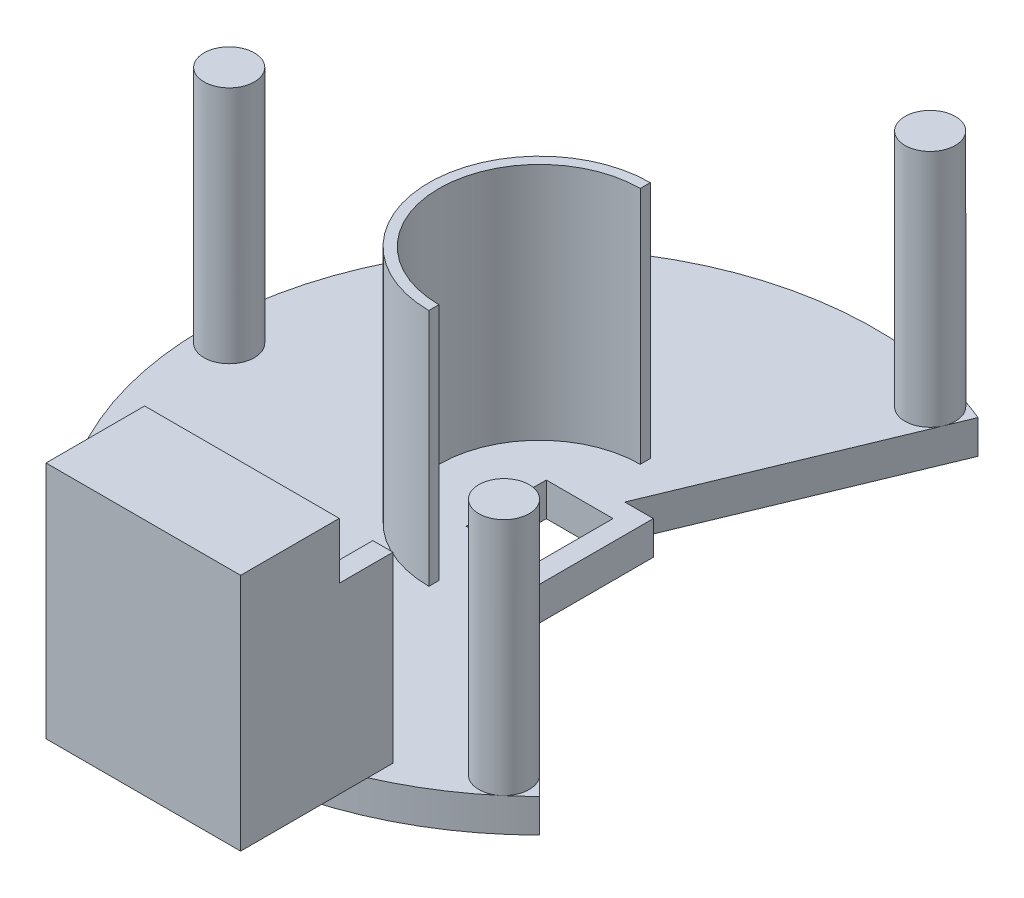
ISO-10303-21;
HEADER;
FILE_DESCRIPTION(('STEP AP214'),'2;1');
FILE_NAME('part.step','',(''),(''),'','','');
FILE_SCHEMA(('AUTOMOTIVE_DESIGN { 1 0 10303 214 1 1 1 1 }'));
ENDSEC;
DATA;
#1=APPLICATION_CONTEXT('core data for automotive mechanical design processes');
#2=APPLICATION_PROTOCOL_DEFINITION('international standard','automotive_design',2000,#1);
#3=PRODUCT_CONTEXT('',#1,'mechanical');
#4=PRODUCT('Part','Part','',(#3));
#5=PRODUCT_RELATED_PRODUCT_CATEGORY('part','',(#4));
#6=PRODUCT_DEFINITION_FORMATION('','',#4);
#7=PRODUCT_DEFINITION_CONTEXT('part definition',#1,'design');
#8=PRODUCT_DEFINITION('design','',#6,#7);
#9=PRODUCT_DEFINITION_SHAPE('','',#8);
#10=(LENGTH_UNIT() NAMED_UNIT(*) SI_UNIT(.MILLI.,.METRE.));
#11=(NAMED_UNIT(*) PLANE_ANGLE_UNIT() SI_UNIT($,.RADIAN.));
#12=(NAMED_UNIT(*) SI_UNIT($,.STERADIAN.) SOLID_ANGLE_UNIT());
#13=UNCERTAINTY_MEASURE_WITH_UNIT(LENGTH_MEASURE(1.E-05),#10,'distance_accuracy_value','');
#14=(GEOMETRIC_REPRESENTATION_CONTEXT(3) GLOBAL_UNCERTAINTY_ASSIGNED_CONTEXT((#13)) GLOBAL_UNIT_ASSIGNED_CONTEXT((#10,
#11,#12)) REPRESENTATION_CONTEXT('',''));
#15=CARTESIAN_POINT('',(0.,0.,0.));
#16=DIRECTION('',(0.,0.,1.));
#17=DIRECTION('',(1.,0.,0.));
#18=AXIS2_PLACEMENT_3D('',#15,#16,#17);
#19=CARTESIAN_POINT('',(0.,5.,0.));
#20=DIRECTION('',(0.,1.,0.));
#21=DIRECTION('',(0.,0.,1.));
#22=AXIS2_PLACEMENT_3D('',#19,#20,#21);
#23=PLANE('',#22);
#24=CARTESIAN_POINT('',(0.,5.,0.));
#25=DIRECTION('',(0.,1.,0.));
#26=DIRECTION('',(0.,0.,1.));
#27=AXIS2_PLACEMENT_3D('',#24,#25,#26);
#28=CIRCLE('',#27,50.);
#29=CARTESIAN_POINT('',(19.1341716182545,5.,-46.1939766255643));
#30=VERTEX_POINT('',#29);
#31=CARTESIAN_POINT('',(15.3257149641942,5.,-47.5933026888897));
#32=VERTEX_POINT('',#31);
#33=EDGE_CURVE('E273',#30,#32,#28,.T.);
#34=ORIENTED_EDGE('',*,*,#33,.T.);
#35=CARTESIAN_POINT('',(14.1762863418796,5.,-44.023804987223));
#36=DIRECTION('',(0.,1.,0.));
#37=DIRECTION('',(0.,0.,1.));
#38=AXIS2_PLACEMENT_3D('',#35,#36,#37);
#39=CIRCLE('',#38,3.75);
#40=CARTESIAN_POINT('',(17.6408345887969,5.,-42.5887421158539));
#41=VERTEX_POINT('',#40);
#42=EDGE_CURVE('E261',#41,#32,#39,.T.);
#43=ORIENTED_EDGE('',*,*,#42,.F.);
#44=DIRECTION('',(0.382683432365091,0.,-0.923879532511287));
#45=VECTOR('',#44,1.);
#46=CARTESIAN_POINT('',(0.,5.,0.));
#47=LINE('',#46,#45);
#48=EDGE_CURVE('E270',#41,#30,#47,.T.);
#49=ORIENTED_EDGE('',*,*,#48,.T.);
#50=EDGE_LOOP('',(#34,#43,#49));
#51=FACE_BOUND('',#50,.T.);
#52=ADVANCED_FACE('F43',(#51),#23,.T.);
#53=DIRECTION('',(0.707106781186544,0.,0.707106781186551));
#54=VECTOR('',#53,1.);
#55=CARTESIAN_POINT('',(0.,5.,0.));
#56=LINE('',#55,#54);
#57=CARTESIAN_POINT('',(32.5960120260131,5.,32.5960120260134));
#58=VERTEX_POINT('',#57);
#59=CARTESIAN_POINT('',(35.3553390593272,5.,35.3553390593276));
#60=VERTEX_POINT('',#59);
#61=EDGE_CURVE('E407',#58,#60,#56,.T.);
#62=ORIENTED_EDGE('',*,*,#61,.F.);
#63=CARTESIAN_POINT('',(29.9443615965636,5.,35.2476624554628));
#64=DIRECTION('',(0.,1.,0.));
#65=DIRECTION('',(0.,0.,1.));
#66=AXIS2_PLACEMENT_3D('',#63,#64,#65);
#67=CIRCLE('',#66,3.75000000000001);
#68=CARTESIAN_POINT('',(32.3722828070958,5.,38.1055810329328));
#69=VERTEX_POINT('',#68);
#70=EDGE_CURVE('E61',#69,#58,#67,.T.);
#71=ORIENTED_EDGE('',*,*,#70,.F.);
#72=EDGE_CURVE('E408',#69,#60,#28,.T.);
#73=ORIENTED_EDGE('',*,*,#72,.T.);
#74=EDGE_LOOP('',(#62,#71,#73));
#75=FACE_BOUND('',#74,.T.);
#76=ADVANCED_FACE('F606',(#75),#23,.T.);
#77=DIRECTION('',(1.,0.,0.));
#78=VECTOR('',#77,1.);
#79=CARTESIAN_POINT('',(0.,5.,-5.975));
#80=LINE('',#79,#78);
#81=CARTESIAN_POINT('',(-4.975,5.,-5.975));
#82=VERTEX_POINT('',#81);
#83=CARTESIAN_POINT('',(4.975,5.,-5.975));
#84=VERTEX_POINT('',#83);
#85=EDGE_CURVE('E296',#82,#84,#80,.T.);
#86=ORIENTED_EDGE('',*,*,#85,.T.);
#87=DIRECTION('',(0.,0.,1.));
#88=VECTOR('',#87,1.);
#89=CARTESIAN_POINT('',(4.975,5.,0.));
#90=LINE('',#89,#88);
#91=CARTESIAN_POINT('',(4.975,5.,5.975));
#92=VERTEX_POINT('',#91);
#93=EDGE_CURVE('E299',#84,#92,#90,.T.);
#94=ORIENTED_EDGE('',*,*,#93,.T.);
#95=DIRECTION('',(1.,0.,0.));
#96=VECTOR('',#95,1.);
#97=CARTESIAN_POINT('',(0.,5.,5.975));
#98=LINE('',#97,#96);
#99=CARTESIAN_POINT('',(-4.975,5.,5.975));
#100=VERTEX_POINT('',#99);
#101=EDGE_CURVE('E301',#100,#92,#98,.T.);
#102=ORIENTED_EDGE('',*,*,#101,.F.);
#103=DIRECTION('',(0.,0.,1.));
#104=VECTOR('',#103,1.);
#105=CARTESIAN_POINT('',(-4.975,5.,0.));
#106=LINE('',#105,#104);
#107=EDGE_CURVE('E304',#82,#100,#106,.T.);
#108=ORIENTED_EDGE('',*,*,#107,.F.);
#109=EDGE_LOOP('',(#86,#94,#102,#108));
#110=FACE_BOUND('',#109,.T.);
#111=CARTESIAN_POINT('',(3.71756672229854,5.,-8.975));
#112=VERTEX_POINT('',#111);
#113=EDGE_CURVE('E278',#112,#41,#47,.T.);
#114=ORIENTED_EDGE('',*,*,#113,.T.);
#115=EDGE_CURVE('E257',#32,#41,#39,.T.);
#116=ORIENTED_EDGE('',*,*,#115,.F.);
#117=CARTESIAN_POINT('',(-50.,5.,0.));
#118=VERTEX_POINT('',#117);
#119=EDGE_CURVE('E292',#32,#118,#28,.T.);
#120=ORIENTED_EDGE('',*,*,#119,.T.);
#121=CARTESIAN_POINT('',(-46.25,5.,0.));
#122=DIRECTION('',(0.,1.,0.));
#123=DIRECTION('',(0.,0.,1.));
#124=AXIS2_PLACEMENT_3D('',#121,#122,#123);
#125=CIRCLE('',#124,3.75000000000001);
#126=EDGE_CURVE('E67',#118,#118,#125,.T.);
#127=ORIENTED_EDGE('',*,*,#126,.F.);
#128=CARTESIAN_POINT('',(-8.85,5.,49.2105425696568));
#129=VERTEX_POINT('',#128);
#130=EDGE_CURVE('E289',#118,#129,#28,.T.);
#131=ORIENTED_EDGE('',*,*,#130,.T.);
#132=DIRECTION('',(0.,0.,-1.));
#133=VECTOR('',#132,1.);
#134=CARTESIAN_POINT('',(-8.85,5.,0.));
#135=LINE('',#134,#133);
#136=CARTESIAN_POINT('',(-8.85,5.,42.));
#137=VERTEX_POINT('',#136);
#138=EDGE_CURVE('E354',#129,#137,#135,.T.);
#139=ORIENTED_EDGE('',*,*,#138,.T.);
#140=DIRECTION('',(1.,0.,0.));
#141=VECTOR('',#140,1.);
#142=CARTESIAN_POINT('',(0.,5.,42.));
#143=LINE('',#142,#141);
#144=CARTESIAN_POINT('',(-6.5,5.,42.));
#145=VERTEX_POINT('',#144);
#146=EDGE_CURVE('E438',#137,#145,#143,.T.);
#147=ORIENTED_EDGE('',*,*,#146,.T.);
#148=CARTESIAN_POINT('',(0.,5.,42.));
#149=DIRECTION('',(0.,1.,0.));
#150=DIRECTION('',(0.,0.,1.));
#151=AXIS2_PLACEMENT_3D('',#148,#149,#150);
#152=CIRCLE('',#151,6.5);
#153=CARTESIAN_POINT('',(5.89100061573825,5.,39.2529812986855));
#154=VERTEX_POINT('',#153);
#155=EDGE_CURVE('E344',#154,#145,#152,.T.);
#156=ORIENTED_EDGE('',*,*,#155,.F.);
#157=DIRECTION('',(0.422618261740694,0.,0.906307787036653));
#158=VECTOR('',#157,1.);
#159=CARTESIAN_POINT('',(-10.1959326897601,5.,4.75444149526796));
#160=LINE('',#159,#158);
#161=CARTESIAN_POINT('',(10.3931608784349,5.,48.9078951392817));
#162=VERTEX_POINT('',#161);
#163=EDGE_CURVE('E376',#154,#162,#160,.T.);
#164=ORIENTED_EDGE('',*,*,#163,.T.);
#165=CARTESIAN_POINT('',(17.15,5.,46.9667701678538));
#166=VERTEX_POINT('',#165);
#167=EDGE_CURVE('E402',#162,#166,#28,.T.);
#168=ORIENTED_EDGE('',*,*,#167,.T.);
#169=DIRECTION('',(0.,0.,-1.));
#170=VECTOR('',#169,1.);
#171=CARTESIAN_POINT('',(17.15,5.,0.));
#172=LINE('',#171,#170);
#173=CARTESIAN_POINT('',(17.15,5.,42.));
#174=VERTEX_POINT('',#173);
#175=EDGE_CURVE('E52',#166,#174,#172,.T.);
#176=ORIENTED_EDGE('',*,*,#175,.T.);
#177=DIRECTION('',(1.,0.,0.));
#178=VECTOR('',#177,1.);
#179=CARTESIAN_POINT('',(0.,5.,42.));
#180=LINE('',#179,#178);
#181=CARTESIAN_POINT('',(20.15,5.,42.));
#182=VERTEX_POINT('',#181);
#183=EDGE_CURVE('E439',#174,#182,#180,.T.);
#184=ORIENTED_EDGE('',*,*,#183,.T.);
#185=DIRECTION('',(0.,0.,-1.));
#186=VECTOR('',#185,1.);
#187=CARTESIAN_POINT('',(20.15,5.,0.));
#188=LINE('',#187,#186);
#189=CARTESIAN_POINT('',(20.15,5.,45.7599989073426));
#190=VERTEX_POINT('',#189);
#191=EDGE_CURVE('E431',#190,#182,#188,.T.);
#192=ORIENTED_EDGE('',*,*,#191,.F.);
#193=EDGE_CURVE('E291',#190,#69,#28,.T.);
#194=ORIENTED_EDGE('',*,*,#193,.T.);
#195=EDGE_CURVE('E587',#58,#69,#67,.T.);
#196=ORIENTED_EDGE('',*,*,#195,.F.);
#197=CARTESIAN_POINT('',(7.975,5.,7.97500000000008));
#198=VERTEX_POINT('',#197);
#199=EDGE_CURVE('E1047',#198,#58,#56,.T.);
#200=ORIENTED_EDGE('',*,*,#199,.F.);
#201=DIRECTION('',(0.,0.,1.));
#202=VECTOR('',#201,1.);
#203=CARTESIAN_POINT('',(7.975,5.,0.));
#204=LINE('',#203,#202);
#205=CARTESIAN_POINT('',(7.975,5.,-8.975));
#206=VERTEX_POINT('',#205);
#207=EDGE_CURVE('E1048',#206,#198,#204,.T.);
#208=ORIENTED_EDGE('',*,*,#207,.F.);
#209=DIRECTION('',(1.,0.,0.));
#210=VECTOR('',#209,1.);
#211=CARTESIAN_POINT('',(0.,5.,-8.975));
#212=LINE('',#211,#210);
#213=EDGE_CURVE('E282',#112,#206,#212,.T.);
#214=ORIENTED_EDGE('',*,*,#213,.F.);
#215=EDGE_LOOP('',(#114,#116,#120,#127,#131,#139,#147,#156,#164,#168,#176,#184,#192,#194,#196,
#200,#208,#214));
#216=FACE_BOUND('',#215,.T.);
#217=DIRECTION('',(0.,0.,-1.));
#218=VECTOR('',#217,1.);
#219=CARTESIAN_POINT('',(0.,5.,-16.5));
#220=LINE('',#219,#218);
#221=CARTESIAN_POINT('',(0.,5.,-15.));
#222=VERTEX_POINT('',#221);
#223=CARTESIAN_POINT('',(0.,5.,-16.5));
#224=VERTEX_POINT('',#223);
#225=EDGE_CURVE('E551',#222,#224,#220,.T.);
#226=ORIENTED_EDGE('',*,*,#225,.F.);
#227=CARTESIAN_POINT('',(0.,5.,0.));
#228=DIRECTION('',(0.,-1.,0.));
#229=DIRECTION('',(0.,0.,1.));
#230=AXIS2_PLACEMENT_3D('',#227,#228,#229);
#231=CIRCLE('',#230,15.);
#232=CARTESIAN_POINT('',(0.,5.,15.));
#233=VERTEX_POINT('',#232);
#234=EDGE_CURVE('E542',#233,#222,#231,.T.);
#235=ORIENTED_EDGE('',*,*,#234,.F.);
#236=DIRECTION('',(0.,0.,-1.));
#237=VECTOR('',#236,1.);
#238=CARTESIAN_POINT('',(0.,5.,15.));
#239=LINE('',#238,#237);
#240=CARTESIAN_POINT('',(0.,5.,16.5));
#241=VERTEX_POINT('',#240);
#242=EDGE_CURVE('E547',#241,#233,#239,.T.);
#243=ORIENTED_EDGE('',*,*,#242,.F.);
#244=CARTESIAN_POINT('',(0.,5.,0.));
#245=DIRECTION('',(0.,1.,0.));
#246=DIRECTION('',(0.,0.,1.));
#247=AXIS2_PLACEMENT_3D('',#244,#245,#246);
#248=CIRCLE('',#247,16.5);
#249=EDGE_CURVE('E548',#224,#241,#248,.T.);
#250=ORIENTED_EDGE('',*,*,#249,.F.);
#251=EDGE_LOOP('',(#226,#235,#243,#250));
#252=FACE_BOUND('',#251,.T.);
#253=ADVANCED_FACE('F284',(#110,#216,#252),#23,.T.);
#254=CARTESIAN_POINT('',(0.,32.23,0.));
#255=DIRECTION('',(0.,1.,0.));
#256=DIRECTION('',(0.,0.,1.));
#257=AXIS2_PLACEMENT_3D('',#254,#255,#256);
#258=PLANE('',#257);
#259=DIRECTION('',(-1.,0.,0.));
#260=VECTOR('',#259,1.);
#261=CARTESIAN_POINT('',(-8.85,32.23,50.));
#262=LINE('',#261,#260);
#263=CARTESIAN_POINT('',(20.15,32.23,50.));
#264=VERTEX_POINT('',#263);
#265=CARTESIAN_POINT('',(17.15,32.23,50.));
#266=VERTEX_POINT('',#265);
#267=EDGE_CURVE('E54',#264,#266,#262,.T.);
#268=ORIENTED_EDGE('',*,*,#267,.F.);
#269=DIRECTION('',(0.,0.,-1.));
#270=VECTOR('',#269,1.);
#271=CARTESIAN_POINT('',(20.15,32.23,0.));
#272=LINE('',#271,#270);
#273=CARTESIAN_POINT('',(20.15,32.23,42.));
#274=VERTEX_POINT('',#273);
#275=EDGE_CURVE('E465',#264,#274,#272,.T.);
#276=ORIENTED_EDGE('',*,*,#275,.T.);
#277=DIRECTION('',(1.,0.,0.));
#278=VECTOR('',#277,1.);
#279=CARTESIAN_POINT('',(0.,32.23,42.));
#280=LINE('',#279,#278);
#281=CARTESIAN_POINT('',(17.15,32.23,42.));
#282=VERTEX_POINT('',#281);
#283=EDGE_CURVE('E472',#282,#274,#280,.T.);
#284=ORIENTED_EDGE('',*,*,#283,.F.);
#285=DIRECTION('',(0.,0.,-1.));
#286=VECTOR('',#285,1.);
#287=CARTESIAN_POINT('',(17.15,32.23,0.));
#288=LINE('',#287,#286);
#289=EDGE_CURVE('E480',#266,#282,#288,.T.);
#290=ORIENTED_EDGE('',*,*,#289,.F.);
#291=EDGE_LOOP('',(#268,#276,#284,#290));
#292=FACE_BOUND('',#291,.T.);
#293=ADVANCED_FACE('F615',(#292),#258,.T.);
#294=CARTESIAN_POINT('',(0.,5.,-5.975));
#295=DIRECTION('',(0.,0.,-1.));
#296=DIRECTION('',(-1.,0.,0.));
#297=AXIS2_PLACEMENT_3D('',#294,#295,#296);
#298=PLANE('',#297);
#299=DIRECTION('',(1.,0.,0.));
#300=VECTOR('',#299,1.);
#301=CARTESIAN_POINT('',(0.,0.,-5.975));
#302=LINE('',#301,#300);
#303=CARTESIAN_POINT('',(-4.975,0.,-5.975));
#304=VERTEX_POINT('',#303);
#305=CARTESIAN_POINT('',(4.975,0.,-5.975));
#306=VERTEX_POINT('',#305);
#307=EDGE_CURVE('E332',#304,#306,#302,.T.);
#308=ORIENTED_EDGE('',*,*,#307,.T.);
#309=DIRECTION('',(0.,-1.,0.));
#310=VECTOR('',#309,1.);
#311=CARTESIAN_POINT('',(4.975,5.,-5.975));
#312=LINE('',#311,#310);
#313=EDGE_CURVE('E351',#84,#306,#312,.T.);
#314=ORIENTED_EDGE('',*,*,#313,.F.);
#315=ORIENTED_EDGE('',*,*,#85,.F.);
#316=DIRECTION('',(0.,-1.,0.));
#317=VECTOR('',#316,1.);
#318=CARTESIAN_POINT('',(-4.975,5.,-5.975));
#319=LINE('',#318,#317);
#320=EDGE_CURVE('E345',#82,#304,#319,.T.);
#321=ORIENTED_EDGE('',*,*,#320,.T.);
#322=EDGE_LOOP('',(#308,#314,#315,#321));
#323=FACE_BOUND('',#322,.T.);
#324=ADVANCED_FACE('F621',(#323),#298,.F.);
#325=CARTESIAN_POINT('',(4.975,5.,0.));
#326=DIRECTION('',(1.,0.,0.));
#327=DIRECTION('',(0.,0.,-1.));
#328=AXIS2_PLACEMENT_3D('',#325,#326,#327);
#329=PLANE('',#328);
#330=DIRECTION('',(0.,0.,1.));
#331=VECTOR('',#330,1.);
#332=CARTESIAN_POINT('',(4.975,0.,0.));
#333=LINE('',#332,#331);
#334=CARTESIAN_POINT('',(4.975,0.,5.975));
#335=VERTEX_POINT('',#334);
#336=EDGE_CURVE('E335',#306,#335,#333,.T.);
#337=ORIENTED_EDGE('',*,*,#336,.T.);
#338=DIRECTION('',(0.,-1.,0.));
#339=VECTOR('',#338,1.);
#340=CARTESIAN_POINT('',(4.975,5.,5.975));
#341=LINE('',#340,#339);
#342=EDGE_CURVE('E349',#92,#335,#341,.T.);
#343=ORIENTED_EDGE('',*,*,#342,.F.);
#344=ORIENTED_EDGE('',*,*,#93,.F.);
#345=ORIENTED_EDGE('',*,*,#313,.T.);
#346=EDGE_LOOP('',(#337,#343,#344,#345));
#347=FACE_BOUND('',#346,.T.);
#348=ADVANCED_FACE('F631',(#347),#329,.F.);
#349=CARTESIAN_POINT('',(0.,5.,5.975));
#350=DIRECTION('',(0.,0.,-1.));
#351=DIRECTION('',(-1.,0.,0.));
#352=AXIS2_PLACEMENT_3D('',#349,#350,#351);
#353=PLANE('',#352);
#354=DIRECTION('',(1.,0.,0.));
#355=VECTOR('',#354,1.);
#356=CARTESIAN_POINT('',(0.,0.,5.975));
#357=LINE('',#356,#355);
#358=CARTESIAN_POINT('',(-4.975,0.,5.975));
#359=VERTEX_POINT('',#358);
#360=EDGE_CURVE('E338',#359,#335,#357,.T.);
#361=ORIENTED_EDGE('',*,*,#360,.F.);
#362=DIRECTION('',(0.,-1.,0.));
#363=VECTOR('',#362,1.);
#364=CARTESIAN_POINT('',(-4.975,5.,5.975));
#365=LINE('',#364,#363);
#366=EDGE_CURVE('E347',#100,#359,#365,.T.);
#367=ORIENTED_EDGE('',*,*,#366,.F.);
#368=ORIENTED_EDGE('',*,*,#101,.T.);
#369=ORIENTED_EDGE('',*,*,#342,.T.);
#370=EDGE_LOOP('',(#361,#367,#368,#369));
#371=FACE_BOUND('',#370,.T.);
#372=ADVANCED_FACE('F634',(#371),#353,.T.);
#373=CARTESIAN_POINT('',(0.,5.,42.));
#374=DIRECTION('',(0.,-1.,0.));
#375=DIRECTION('',(0.,0.,-1.));
#376=AXIS2_PLACEMENT_3D('',#373,#374,#375);
#377=CYLINDRICAL_SURFACE('',#376,6.5);
#378=CARTESIAN_POINT('',(0.,0.,42.));
#379=DIRECTION('',(0.,1.,0.));
#380=DIRECTION('',(0.,0.,1.));
#381=AXIS2_PLACEMENT_3D('',#378,#379,#380);
#382=CIRCLE('',#381,6.5);
#383=CARTESIAN_POINT('',(5.89100061573825,0.,39.2529812986855));
#384=VERTEX_POINT('',#383);
#385=CARTESIAN_POINT('',(-6.5,0.,42.));
#386=VERTEX_POINT('',#385);
#387=EDGE_CURVE('E308',#384,#386,#382,.T.);
#388=ORIENTED_EDGE('',*,*,#387,.F.);
#389=DIRECTION('',(0.,-1.,0.));
#390=VECTOR('',#389,1.);
#391=CARTESIAN_POINT('',(5.89100061573825,5.,39.2529812986855));
#392=LINE('',#391,#390);
#393=EDGE_CURVE('E47',#154,#384,#392,.T.);
#394=ORIENTED_EDGE('',*,*,#393,.F.);
#395=ORIENTED_EDGE('',*,*,#155,.T.);
#396=DIRECTION('',(0.,-1.,0.));
#397=VECTOR('',#396,1.);
#398=CARTESIAN_POINT('',(-6.5,5.,42.));
#399=LINE('',#398,#397);
#400=EDGE_CURVE('E307',#145,#386,#399,.T.);
#401=ORIENTED_EDGE('',*,*,#400,.T.);
#402=EDGE_LOOP('',(#388,#394,#395,#401));
#403=FACE_BOUND('',#402,.T.);
#404=ADVANCED_FACE('F45',(#403),#377,.F.);
#405=CARTESIAN_POINT('',(-10.1959326897601,5.,4.75444149526796));
#406=DIRECTION('',(0.906307787036653,0.,-0.422618261740694));
#407=DIRECTION('',(-0.422618261740694,0.,-0.906307787036653));
#408=AXIS2_PLACEMENT_3D('',#405,#406,#407);
#409=PLANE('',#408);
#410=DIRECTION('',(0.422618261740694,0.,0.906307787036653));
#411=VECTOR('',#410,1.);
#412=CARTESIAN_POINT('',(-10.1959326897601,0.,4.75444149526796));
#413=LINE('',#412,#411);
#414=CARTESIAN_POINT('',(10.3931608784349,0.,48.9078951392817));
#415=VERTEX_POINT('',#414);
#416=EDGE_CURVE('E311',#384,#415,#413,.T.);
#417=ORIENTED_EDGE('',*,*,#416,.T.);
#418=DIRECTION('',(0.,-1.,0.));
#419=VECTOR('',#418,1.);
#420=CARTESIAN_POINT('',(10.3931608784349,5.,48.9078951392817));
#421=LINE('',#420,#419);
#422=EDGE_CURVE('E366',#162,#415,#421,.T.);
#423=ORIENTED_EDGE('',*,*,#422,.F.);
#424=ORIENTED_EDGE('',*,*,#163,.F.);
#425=ORIENTED_EDGE('',*,*,#393,.T.);
#426=EDGE_LOOP('',(#417,#423,#424,#425));
#427=FACE_BOUND('',#426,.T.);
#428=ADVANCED_FACE('F375',(#427),#409,.F.);
#429=CARTESIAN_POINT('',(0.,5.,0.));
#430=DIRECTION('',(0.,-1.,0.));
#431=DIRECTION('',(0.,0.,-1.));
#432=AXIS2_PLACEMENT_3D('',#429,#430,#431);
#433=CYLINDRICAL_SURFACE('',#432,50.);
#434=CARTESIAN_POINT('',(0.,0.,0.));
#435=DIRECTION('',(0.,1.,0.));
#436=DIRECTION('',(0.,0.,1.));
#437=AXIS2_PLACEMENT_3D('',#434,#435,#436);
#438=CIRCLE('',#437,50.);
#439=CARTESIAN_POINT('',(35.3553390593272,0.,35.3553390593276));
#440=VERTEX_POINT('',#439);
#441=EDGE_CURVE('E314',#415,#440,#438,.T.);
#442=ORIENTED_EDGE('',*,*,#441,.T.);
#443=DIRECTION('',(0.,-1.,0.));
#444=VECTOR('',#443,1.);
#445=CARTESIAN_POINT('',(35.3553390593272,5.,35.3553390593276));
#446=LINE('',#445,#444);
#447=EDGE_CURVE('E365',#60,#440,#446,.T.);
#448=ORIENTED_EDGE('',*,*,#447,.F.);
#449=ORIENTED_EDGE('',*,*,#72,.F.);
#450=ORIENTED_EDGE('',*,*,#193,.F.);
#451=EDGE_CURVE('E403',#166,#190,#28,.T.);
#452=ORIENTED_EDGE('',*,*,#451,.F.);
#453=ORIENTED_EDGE('',*,*,#167,.F.);
#454=ORIENTED_EDGE('',*,*,#422,.T.);
#455=EDGE_LOOP('',(#442,#448,#449,#450,#452,#453,#454));
#456=FACE_BOUND('',#455,.T.);
#457=ADVANCED_FACE('F657',(#456),#433,.T.);
#458=CARTESIAN_POINT('',(0.,5.,0.));
#459=DIRECTION('',(0.707106781186551,0.,-0.707106781186544));
#460=DIRECTION('',(-0.707106781186544,0.,-0.707106781186551));
#461=AXIS2_PLACEMENT_3D('',#458,#459,#460);
#462=PLANE('',#461);
#463=DIRECTION('',(0.707106781186544,0.,0.707106781186551));
#464=VECTOR('',#463,1.);
#465=CARTESIAN_POINT('',(0.,0.,0.));
#466=LINE('',#465,#464);
#467=CARTESIAN_POINT('',(7.975,0.,7.97500000000008));
#468=VERTEX_POINT('',#467);
#469=EDGE_CURVE('E317',#468,#440,#466,.T.);
#470=ORIENTED_EDGE('',*,*,#469,.F.);
#471=DIRECTION('',(0.,-1.,0.));
#472=VECTOR('',#471,1.);
#473=CARTESIAN_POINT('',(7.975,5.,7.97500000000008));
#474=LINE('',#473,#472);
#475=EDGE_CURVE('E363',#198,#468,#474,.T.);
#476=ORIENTED_EDGE('',*,*,#475,.F.);
#477=ORIENTED_EDGE('',*,*,#199,.T.);
#478=ORIENTED_EDGE('',*,*,#61,.T.);
#479=ORIENTED_EDGE('',*,*,#447,.T.);
#480=EDGE_LOOP('',(#470,#476,#477,#478,#479));
#481=FACE_BOUND('',#480,.T.);
#482=ADVANCED_FACE('F667',(#481),#462,.T.);
#483=CARTESIAN_POINT('',(7.975,5.,0.));
#484=DIRECTION('',(1.,0.,0.));
#485=DIRECTION('',(0.,0.,-1.));
#486=AXIS2_PLACEMENT_3D('',#483,#484,#485);
#487=PLANE('',#486);
#488=DIRECTION('',(0.,0.,1.));
#489=VECTOR('',#488,1.);
#490=CARTESIAN_POINT('',(7.975,0.,0.));
#491=LINE('',#490,#489);
#492=CARTESIAN_POINT('',(7.975,0.,-8.975));
#493=VERTEX_POINT('',#492);
#494=EDGE_CURVE('E321',#493,#468,#491,.T.);
#495=ORIENTED_EDGE('',*,*,#494,.F.);
#496=DIRECTION('',(0.,-1.,0.));
#497=VECTOR('',#496,1.);
#498=CARTESIAN_POINT('',(7.975,5.,-8.975));
#499=LINE('',#498,#497);
#500=EDGE_CURVE('E361',#206,#493,#499,.T.);
#501=ORIENTED_EDGE('',*,*,#500,.F.);
#502=ORIENTED_EDGE('',*,*,#207,.T.);
#503=ORIENTED_EDGE('',*,*,#475,.T.);
#504=EDGE_LOOP('',(#495,#501,#502,#503));
#505=FACE_BOUND('',#504,.T.);
#506=ADVANCED_FACE('F663',(#505),#487,.T.);
#507=CARTESIAN_POINT('',(0.,5.,-8.975));
#508=DIRECTION('',(0.,0.,-1.));
#509=DIRECTION('',(-1.,0.,0.));
#510=AXIS2_PLACEMENT_3D('',#507,#508,#509);
#511=PLANE('',#510);
#512=DIRECTION('',(1.,0.,0.));
#513=VECTOR('',#512,1.);
#514=CARTESIAN_POINT('',(0.,0.,-8.975));
#515=LINE('',#514,#513);
#516=CARTESIAN_POINT('',(3.71756672229854,0.,-8.975));
#517=VERTEX_POINT('',#516);
#518=EDGE_CURVE('E324',#517,#493,#515,.T.);
#519=ORIENTED_EDGE('',*,*,#518,.F.);
#520=DIRECTION('',(0.,-1.,0.));
#521=VECTOR('',#520,1.);
#522=CARTESIAN_POINT('',(3.71756672229854,5.,-8.975));
#523=LINE('',#522,#521);
#524=EDGE_CURVE('E359',#112,#517,#523,.T.);
#525=ORIENTED_EDGE('',*,*,#524,.F.);
#526=ORIENTED_EDGE('',*,*,#213,.T.);
#527=ORIENTED_EDGE('',*,*,#500,.T.);
#528=EDGE_LOOP('',(#519,#525,#526,#527));
#529=FACE_BOUND('',#528,.T.);
#530=ADVANCED_FACE('F660',(#529),#511,.T.);
#531=CARTESIAN_POINT('',(0.,5.,0.));
#532=DIRECTION('',(-0.923879532511287,0.,-0.382683432365091));
#533=DIRECTION('',(-0.382683432365091,0.,0.923879532511287));
#534=AXIS2_PLACEMENT_3D('',#531,#532,#533);
#535=PLANE('',#534);
#536=DIRECTION('',(0.382683432365091,0.,-0.923879532511287));
#537=VECTOR('',#536,1.);
#538=CARTESIAN_POINT('',(0.,0.,0.));
#539=LINE('',#538,#537);
#540=CARTESIAN_POINT('',(19.1341716182545,0.,-46.1939766255643));
#541=VERTEX_POINT('',#540);
#542=EDGE_CURVE('E327',#517,#541,#539,.T.);
#543=ORIENTED_EDGE('',*,*,#542,.T.);
#544=DIRECTION('',(0.,-1.,0.));
#545=VECTOR('',#544,1.);
#546=CARTESIAN_POINT('',(19.1341716182545,5.,-46.1939766255643));
#547=LINE('',#546,#545);
#548=EDGE_CURVE('E281',#30,#541,#547,.T.);
#549=ORIENTED_EDGE('',*,*,#548,.F.);
#550=ORIENTED_EDGE('',*,*,#48,.F.);
#551=ORIENTED_EDGE('',*,*,#113,.F.);
#552=ORIENTED_EDGE('',*,*,#524,.T.);
#553=EDGE_LOOP('',(#543,#549,#550,#551,#552));
#554=FACE_BOUND('',#553,.T.);
#555=ADVANCED_FACE('F277',(#554),#535,.F.);
#556=CARTESIAN_POINT('',(-6.5,0.,49.5756996924905));
#557=VERTEX_POINT('',#556);
#558=EDGE_CURVE('E318',#541,#557,#438,.T.);
#559=ORIENTED_EDGE('',*,*,#558,.T.);
#560=DIRECTION('',(0.,-1.,0.));
#561=VECTOR('',#560,1.);
#562=CARTESIAN_POINT('',(-6.5,5.,49.5756996924905));
#563=LINE('',#562,#561);
#564=CARTESIAN_POINT('',(-6.5,5.,49.5756996924905));
#565=VERTEX_POINT('',#564);
#566=EDGE_CURVE('E356',#565,#557,#563,.T.);
#567=ORIENTED_EDGE('',*,*,#566,.F.);
#568=EDGE_CURVE('E288',#129,#565,#28,.T.);
#569=ORIENTED_EDGE('',*,*,#568,.F.);
#570=ORIENTED_EDGE('',*,*,#130,.F.);
#571=ORIENTED_EDGE('',*,*,#119,.F.);
#572=ORIENTED_EDGE('',*,*,#33,.F.);
#573=ORIENTED_EDGE('',*,*,#548,.T.);
#574=EDGE_LOOP('',(#559,#567,#569,#570,#571,#572,#573));
#575=FACE_BOUND('',#574,.T.);
#576=ADVANCED_FACE('F399',(#575),#433,.T.);
#577=CARTESIAN_POINT('',(-6.5,5.,0.));
#578=DIRECTION('',(1.,0.,0.));
#579=DIRECTION('',(0.,0.,-1.));
#580=AXIS2_PLACEMENT_3D('',#577,#578,#579);
#581=PLANE('',#580);
#582=DIRECTION('',(0.,0.,1.));
#583=VECTOR('',#582,1.);
#584=CARTESIAN_POINT('',(-6.5,0.,0.));
#585=LINE('',#584,#583);
#586=EDGE_CURVE('E329',#386,#557,#585,.T.);
#587=ORIENTED_EDGE('',*,*,#586,.F.);
#588=ORIENTED_EDGE('',*,*,#400,.F.);
#589=DIRECTION('',(0.,-1.,0.));
#590=VECTOR('',#589,1.);
#591=CARTESIAN_POINT('',(-6.5,101.287842728023,42.));
#592=LINE('',#591,#590);
#593=CARTESIAN_POINT('',(-6.5,32.23,42.));
#594=VERTEX_POINT('',#593);
#595=EDGE_CURVE('E390',#594,#145,#592,.T.);
#596=ORIENTED_EDGE('',*,*,#595,.F.);
#597=DIRECTION('',(0.,0.,-1.));
#598=VECTOR('',#597,1.);
#599=CARTESIAN_POINT('',(-6.5,32.23,0.));
#600=LINE('',#599,#598);
#601=CARTESIAN_POINT('',(-6.5,32.23,49.5756996924905));
#602=VERTEX_POINT('',#601);
#603=EDGE_CURVE('E463',#602,#594,#600,.T.);
#604=ORIENTED_EDGE('',*,*,#603,.F.);
#605=DIRECTION('',(0.,-1.,0.));
#606=VECTOR('',#605,1.);
#607=CARTESIAN_POINT('',(-6.5,101.287842728023,49.5756996924905));
#608=LINE('',#607,#606);
#609=EDGE_CURVE('E482',#602,#565,#608,.T.);
#610=ORIENTED_EDGE('',*,*,#609,.T.);
#611=ORIENTED_EDGE('',*,*,#566,.T.);
#612=EDGE_LOOP('',(#587,#588,#596,#604,#610,#611));
#613=FACE_BOUND('',#612,.T.);
#614=ADVANCED_FACE('F388',(#613),#581,.T.);
#615=CARTESIAN_POINT('',(-4.975,5.,0.));
#616=DIRECTION('',(1.,0.,0.));
#617=DIRECTION('',(0.,0.,-1.));
#618=AXIS2_PLACEMENT_3D('',#615,#616,#617);
#619=PLANE('',#618);
#620=DIRECTION('',(0.,0.,1.));
#621=VECTOR('',#620,1.);
#622=CARTESIAN_POINT('',(-4.975,0.,0.));
#623=LINE('',#622,#621);
#624=EDGE_CURVE('E341',#304,#359,#623,.T.);
#625=ORIENTED_EDGE('',*,*,#624,.F.);
#626=ORIENTED_EDGE('',*,*,#320,.F.);
#627=ORIENTED_EDGE('',*,*,#107,.T.);
#628=ORIENTED_EDGE('',*,*,#366,.T.);
#629=EDGE_LOOP('',(#625,#626,#627,#628));
#630=FACE_BOUND('',#629,.T.);
#631=ADVANCED_FACE('F637',(#630),#619,.T.);
#632=CARTESIAN_POINT('',(0.,0.,0.));
#633=DIRECTION('',(0.,1.,0.));
#634=DIRECTION('',(0.,0.,1.));
#635=AXIS2_PLACEMENT_3D('',#632,#633,#634);
#636=PLANE('',#635);
#637=ORIENTED_EDGE('',*,*,#387,.T.);
#638=ORIENTED_EDGE('',*,*,#586,.T.);
#639=ORIENTED_EDGE('',*,*,#558,.F.);
#640=ORIENTED_EDGE('',*,*,#542,.F.);
#641=ORIENTED_EDGE('',*,*,#518,.T.);
#642=ORIENTED_EDGE('',*,*,#494,.T.);
#643=ORIENTED_EDGE('',*,*,#469,.T.);
#644=ORIENTED_EDGE('',*,*,#441,.F.);
#645=ORIENTED_EDGE('',*,*,#416,.F.);
#646=EDGE_LOOP('',(#637,#638,#639,#640,#641,#642,#643,#644,#645));
#647=FACE_BOUND('',#646,.T.);
#648=ORIENTED_EDGE('',*,*,#307,.F.);
#649=ORIENTED_EDGE('',*,*,#624,.T.);
#650=ORIENTED_EDGE('',*,*,#360,.T.);
#651=ORIENTED_EDGE('',*,*,#336,.F.);
#652=EDGE_LOOP('',(#648,#649,#650,#651));
#653=FACE_BOUND('',#652,.T.);
#654=ADVANCED_FACE('F382',(#647,#653),#636,.F.);
#655=CARTESIAN_POINT('',(0.,5.,0.));
#656=DIRECTION('',(0.,1.,0.));
#657=DIRECTION('',(0.,0.,1.));
#658=AXIS2_PLACEMENT_3D('',#655,#656,#657);
#659=PLANE('',#658);
#660=CARTESIAN_POINT('',(17.15,5.,61.7));
#661=VERTEX_POINT('',#660);
#662=EDGE_CURVE('E442',#661,#166,#172,.T.);
#663=ORIENTED_EDGE('',*,*,#662,.T.);
#664=ORIENTED_EDGE('',*,*,#451,.T.);
#665=CARTESIAN_POINT('',(20.15,5.,64.7));
#666=VERTEX_POINT('',#665);
#667=EDGE_CURVE('E488',#666,#190,#188,.T.);
#668=ORIENTED_EDGE('',*,*,#667,.F.);
#669=DIRECTION('',(1.,0.,0.));
#670=VECTOR('',#669,1.);
#671=CARTESIAN_POINT('',(0.,5.,64.7));
#672=LINE('',#671,#670);
#673=CARTESIAN_POINT('',(-8.85,5.,64.7));
#674=VERTEX_POINT('',#673);
#675=EDGE_CURVE('E437',#674,#666,#672,.T.);
#676=ORIENTED_EDGE('',*,*,#675,.F.);
#677=EDGE_CURVE('E427',#674,#129,#135,.T.);
#678=ORIENTED_EDGE('',*,*,#677,.T.);
#679=ORIENTED_EDGE('',*,*,#568,.T.);
#680=DIRECTION('',(-0.837382245048691,0.,-0.546617760118727));
#681=VECTOR('',#680,1.);
#682=CARTESIAN_POINT('',(-24.634327565297,5.,37.7381600579768));
#683=LINE('',#682,#681);
#684=CARTESIAN_POINT('',(-5.84999999999999,5.,50.));
#685=VERTEX_POINT('',#684);
#686=EDGE_CURVE('E447',#685,#565,#683,.T.);
#687=ORIENTED_EDGE('',*,*,#686,.F.);
#688=DIRECTION('',(0.,0.,-1.));
#689=VECTOR('',#688,1.);
#690=CARTESIAN_POINT('',(-5.84999999999999,5.,0.));
#691=LINE('',#690,#689);
#692=CARTESIAN_POINT('',(-5.84999999999999,5.,61.7));
#693=VERTEX_POINT('',#692);
#694=EDGE_CURVE('E312',#693,#685,#691,.T.);
#695=ORIENTED_EDGE('',*,*,#694,.F.);
#696=DIRECTION('',(1.,0.,0.));
#697=VECTOR('',#696,1.);
#698=CARTESIAN_POINT('',(0.,5.,61.7));
#699=LINE('',#698,#697);
#700=EDGE_CURVE('E471',#693,#661,#699,.T.);
#701=ORIENTED_EDGE('',*,*,#700,.T.);
#702=EDGE_LOOP('',(#663,#664,#668,#676,#678,#679,#687,#695,#701));
#703=FACE_BOUND('',#702,.T.);
#704=ADVANCED_FACE('F434',(#703),#659,.F.);
#705=CARTESIAN_POINT('',(-5.84999999999999,32.23,50.));
#706=VERTEX_POINT('',#705);
#707=CARTESIAN_POINT('',(-8.85,32.23,50.));
#708=VERTEX_POINT('',#707);
#709=EDGE_CURVE('E12',#706,#708,#262,.T.);
#710=ORIENTED_EDGE('',*,*,#709,.F.);
#711=DIRECTION('',(-0.837382245048691,0.,-0.546617760118727));
#712=VECTOR('',#711,1.);
#713=CARTESIAN_POINT('',(-24.634327565297,32.23,37.7381600579768));
#714=LINE('',#713,#712);
#715=EDGE_CURVE('E460',#706,#602,#714,.T.);
#716=ORIENTED_EDGE('',*,*,#715,.T.);
#717=ORIENTED_EDGE('',*,*,#603,.T.);
#718=DIRECTION('',(1.,0.,0.));
#719=VECTOR('',#718,1.);
#720=CARTESIAN_POINT('',(0.,32.23,42.));
#721=LINE('',#720,#719);
#722=CARTESIAN_POINT('',(-8.85,32.23,42.));
#723=VERTEX_POINT('',#722);
#724=EDGE_CURVE('E466',#723,#594,#721,.T.);
#725=ORIENTED_EDGE('',*,*,#724,.F.);
#726=DIRECTION('',(0.,0.,-1.));
#727=VECTOR('',#726,1.);
#728=CARTESIAN_POINT('',(-8.85,32.23,0.));
#729=LINE('',#728,#727);
#730=EDGE_CURVE('E468',#708,#723,#729,.T.);
#731=ORIENTED_EDGE('',*,*,#730,.F.);
#732=EDGE_LOOP('',(#710,#716,#717,#725,#731));
#733=FACE_BOUND('',#732,.T.);
#734=ADVANCED_FACE('F622',(#733),#258,.T.);
#735=CARTESIAN_POINT('',(0.,101.287842728023,61.7));
#736=DIRECTION('',(0.,0.,-1.));
#737=DIRECTION('',(-1.,0.,0.));
#738=AXIS2_PLACEMENT_3D('',#735,#736,#737);
#739=PLANE('',#738);
#740=DIRECTION('',(0.,-1.,0.));
#741=VECTOR('',#740,1.);
#742=CARTESIAN_POINT('',(-5.84999999999999,101.287842728023,61.7));
#743=LINE('',#742,#741);
#744=CARTESIAN_POINT('',(-5.84999999999999,32.23,61.7));
#745=VERTEX_POINT('',#744);
#746=EDGE_CURVE('E450',#745,#693,#743,.T.);
#747=ORIENTED_EDGE('',*,*,#746,.F.);
#748=DIRECTION('',(1.,0.,0.));
#749=VECTOR('',#748,1.);
#750=CARTESIAN_POINT('',(0.,32.23,61.7));
#751=LINE('',#750,#749);
#752=CARTESIAN_POINT('',(17.15,32.23,61.7));
#753=VERTEX_POINT('',#752);
#754=EDGE_CURVE('E440',#745,#753,#751,.T.);
#755=ORIENTED_EDGE('',*,*,#754,.T.);
#756=DIRECTION('',(0.,-1.,0.));
#757=VECTOR('',#756,1.);
#758=CARTESIAN_POINT('',(17.15,101.287842728023,61.7));
#759=LINE('',#758,#757);
#760=EDGE_CURVE('E456',#753,#661,#759,.T.);
#761=ORIENTED_EDGE('',*,*,#760,.T.);
#762=ORIENTED_EDGE('',*,*,#700,.F.);
#763=EDGE_LOOP('',(#747,#755,#761,#762));
#764=FACE_BOUND('',#763,.T.);
#765=ADVANCED_FACE('F506',(#764),#739,.T.);
#766=CARTESIAN_POINT('',(17.15,101.287842728023,0.));
#767=DIRECTION('',(-1.,0.,0.));
#768=DIRECTION('',(0.,0.,1.));
#769=AXIS2_PLACEMENT_3D('',#766,#767,#768);
#770=PLANE('',#769);
#771=ORIENTED_EDGE('',*,*,#760,.F.);
#772=EDGE_CURVE('E477',#753,#266,#288,.T.);
#773=ORIENTED_EDGE('',*,*,#772,.T.);
#774=ORIENTED_EDGE('',*,*,#289,.T.);
#775=DIRECTION('',(0.,-1.,0.));
#776=VECTOR('',#775,1.);
#777=CARTESIAN_POINT('',(17.15,101.287842728023,42.));
#778=LINE('',#777,#776);
#779=EDGE_CURVE('E476',#282,#174,#778,.T.);
#780=ORIENTED_EDGE('',*,*,#779,.T.);
#781=ORIENTED_EDGE('',*,*,#175,.F.);
#782=ORIENTED_EDGE('',*,*,#662,.F.);
#783=EDGE_LOOP('',(#771,#773,#774,#780,#781,#782));
#784=FACE_BOUND('',#783,.T.);
#785=ADVANCED_FACE('F519',(#784),#770,.T.);
#786=CARTESIAN_POINT('',(0.,101.287842728023,42.));
#787=DIRECTION('',(0.,0.,-1.));
#788=DIRECTION('',(-1.,0.,0.));
#789=AXIS2_PLACEMENT_3D('',#786,#787,#788);
#790=PLANE('',#789);
#791=ORIENTED_EDGE('',*,*,#779,.F.);
#792=ORIENTED_EDGE('',*,*,#283,.T.);
#793=DIRECTION('',(0.,-1.,0.));
#794=VECTOR('',#793,1.);
#795=CARTESIAN_POINT('',(20.15,101.287842728023,42.));
#796=LINE('',#795,#794);
#797=EDGE_CURVE('E475',#274,#182,#796,.T.);
#798=ORIENTED_EDGE('',*,*,#797,.T.);
#799=ORIENTED_EDGE('',*,*,#183,.F.);
#800=EDGE_LOOP('',(#791,#792,#798,#799));
#801=FACE_BOUND('',#800,.T.);
#802=ADVANCED_FACE('F522',(#801),#790,.T.);
#803=CARTESIAN_POINT('',(20.15,101.287842728023,0.));
#804=DIRECTION('',(-1.,0.,0.));
#805=DIRECTION('',(0.,0.,1.));
#806=AXIS2_PLACEMENT_3D('',#803,#804,#805);
#807=PLANE('',#806);
#808=ORIENTED_EDGE('',*,*,#275,.F.);
#809=DIRECTION('',(0.,-1.,0.));
#810=VECTOR('',#809,1.);
#811=CARTESIAN_POINT('',(20.15,35.23,50.));
#812=LINE('',#811,#810);
#813=CARTESIAN_POINT('',(20.15,40.6,50.));
#814=VERTEX_POINT('',#813);
#815=EDGE_CURVE('E461',#814,#264,#812,.T.);
#816=ORIENTED_EDGE('',*,*,#815,.F.);
#817=DIRECTION('',(0.,0.,-1.));
#818=VECTOR('',#817,1.);
#819=CARTESIAN_POINT('',(20.15,40.6,64.7));
#820=LINE('',#819,#818);
#821=CARTESIAN_POINT('',(20.15,40.6,64.7));
#822=VERTEX_POINT('',#821);
#823=EDGE_CURVE('E573',#822,#814,#820,.T.);
#824=ORIENTED_EDGE('',*,*,#823,.F.);
#825=DIRECTION('',(0.,-1.,0.));
#826=VECTOR('',#825,1.);
#827=CARTESIAN_POINT('',(20.15,101.287842728023,64.7));
#828=LINE('',#827,#826);
#829=EDGE_CURVE('E489',#822,#666,#828,.T.);
#830=ORIENTED_EDGE('',*,*,#829,.T.);
#831=ORIENTED_EDGE('',*,*,#667,.T.);
#832=ORIENTED_EDGE('',*,*,#191,.T.);
#833=ORIENTED_EDGE('',*,*,#797,.F.);
#834=EDGE_LOOP('',(#808,#816,#824,#830,#831,#832,#833));
#835=FACE_BOUND('',#834,.T.);
#836=ADVANCED_FACE('F524',(#835),#807,.F.);
#837=CARTESIAN_POINT('',(0.,101.287842728023,64.7));
#838=DIRECTION('',(0.,0.,-1.));
#839=DIRECTION('',(-1.,0.,0.));
#840=AXIS2_PLACEMENT_3D('',#837,#838,#839);
#841=PLANE('',#840);
#842=ORIENTED_EDGE('',*,*,#829,.F.);
#843=DIRECTION('',(1.,0.,0.));
#844=VECTOR('',#843,1.);
#845=CARTESIAN_POINT('',(-8.85,40.6,64.7));
#846=LINE('',#845,#844);
#847=CARTESIAN_POINT('',(-8.85,40.6,64.7));
#848=VERTEX_POINT('',#847);
#849=EDGE_CURVE('E543',#848,#822,#846,.T.);
#850=ORIENTED_EDGE('',*,*,#849,.F.);
#851=DIRECTION('',(0.,-1.,0.));
#852=VECTOR('',#851,1.);
#853=CARTESIAN_POINT('',(-8.85,101.287842728023,64.7));
#854=LINE('',#853,#852);
#855=EDGE_CURVE('E486',#848,#674,#854,.T.);
#856=ORIENTED_EDGE('',*,*,#855,.T.);
#857=ORIENTED_EDGE('',*,*,#675,.T.);
#858=EDGE_LOOP('',(#842,#850,#856,#857));
#859=FACE_BOUND('',#858,.T.);
#860=ADVANCED_FACE('F812',(#859),#841,.F.);
#861=CARTESIAN_POINT('',(-8.85,101.287842728023,0.));
#862=DIRECTION('',(-1.,0.,0.));
#863=DIRECTION('',(0.,0.,1.));
#864=AXIS2_PLACEMENT_3D('',#861,#862,#863);
#865=PLANE('',#864);
#866=ORIENTED_EDGE('',*,*,#855,.F.);
#867=DIRECTION('',(0.,0.,1.));
#868=VECTOR('',#867,1.);
#869=CARTESIAN_POINT('',(-8.85,40.6,50.));
#870=LINE('',#869,#868);
#871=CARTESIAN_POINT('',(-8.85,40.6,50.));
#872=VERTEX_POINT('',#871);
#873=EDGE_CURVE('E576',#872,#848,#870,.T.);
#874=ORIENTED_EDGE('',*,*,#873,.F.);
#875=DIRECTION('',(0.,-1.,0.));
#876=VECTOR('',#875,1.);
#877=CARTESIAN_POINT('',(-8.85,35.23,50.));
#878=LINE('',#877,#876);
#879=EDGE_CURVE('E536',#872,#708,#878,.T.);
#880=ORIENTED_EDGE('',*,*,#879,.T.);
#881=ORIENTED_EDGE('',*,*,#730,.T.);
#882=DIRECTION('',(0.,-1.,0.));
#883=VECTOR('',#882,1.);
#884=CARTESIAN_POINT('',(-8.85,101.287842728023,42.));
#885=LINE('',#884,#883);
#886=EDGE_CURVE('E429',#723,#137,#885,.T.);
#887=ORIENTED_EDGE('',*,*,#886,.T.);
#888=ORIENTED_EDGE('',*,*,#138,.F.);
#889=ORIENTED_EDGE('',*,*,#677,.F.);
#890=EDGE_LOOP('',(#866,#874,#880,#881,#887,#888,#889));
#891=FACE_BOUND('',#890,.T.);
#892=ADVANCED_FACE('F426',(#891),#865,.T.);
#893=CARTESIAN_POINT('',(0.,101.287842728023,42.));
#894=DIRECTION('',(0.,0.,-1.));
#895=DIRECTION('',(-1.,0.,0.));
#896=AXIS2_PLACEMENT_3D('',#893,#894,#895);
#897=PLANE('',#896);
#898=ORIENTED_EDGE('',*,*,#886,.F.);
#899=ORIENTED_EDGE('',*,*,#724,.T.);
#900=ORIENTED_EDGE('',*,*,#595,.T.);
#901=ORIENTED_EDGE('',*,*,#146,.F.);
#902=EDGE_LOOP('',(#898,#899,#900,#901));
#903=FACE_BOUND('',#902,.T.);
#904=ADVANCED_FACE('F702',(#903),#897,.T.);
#905=CARTESIAN_POINT('',(-24.634327565297,101.287842728023,37.7381600579768));
#906=DIRECTION('',(-0.546617760118727,0.,0.837382245048691));
#907=DIRECTION('',(0.837382245048691,0.,0.546617760118727));
#908=AXIS2_PLACEMENT_3D('',#905,#906,#907);
#909=PLANE('',#908);
#910=ORIENTED_EDGE('',*,*,#715,.F.);
#911=DIRECTION('',(0.,-1.,0.));
#912=VECTOR('',#911,1.);
#913=CARTESIAN_POINT('',(-5.84999999999999,101.287842728023,50.));
#914=LINE('',#913,#912);
#915=EDGE_CURVE('E451',#706,#685,#914,.T.);
#916=ORIENTED_EDGE('',*,*,#915,.T.);
#917=ORIENTED_EDGE('',*,*,#686,.T.);
#918=ORIENTED_EDGE('',*,*,#609,.F.);
#919=EDGE_LOOP('',(#910,#916,#917,#918));
#920=FACE_BOUND('',#919,.T.);
#921=ADVANCED_FACE('F705',(#920),#909,.F.);
#922=CARTESIAN_POINT('',(-5.84999999999999,101.287842728023,0.));
#923=DIRECTION('',(-1.,0.,0.));
#924=DIRECTION('',(0.,0.,1.));
#925=AXIS2_PLACEMENT_3D('',#922,#923,#924);
#926=PLANE('',#925);
#927=DIRECTION('',(0.,0.,-1.));
#928=VECTOR('',#927,1.);
#929=CARTESIAN_POINT('',(-5.84999999999999,32.23,0.));
#930=LINE('',#929,#928);
#931=EDGE_CURVE('E457',#745,#706,#930,.T.);
#932=ORIENTED_EDGE('',*,*,#931,.F.);
#933=ORIENTED_EDGE('',*,*,#746,.T.);
#934=ORIENTED_EDGE('',*,*,#694,.T.);
#935=ORIENTED_EDGE('',*,*,#915,.F.);
#936=EDGE_LOOP('',(#932,#933,#934,#935));
#937=FACE_BOUND('',#936,.T.);
#938=ADVANCED_FACE('F500',(#937),#926,.F.);
#939=CARTESIAN_POINT('',(-8.85,35.23,50.));
#940=DIRECTION('',(0.,0.,1.));
#941=DIRECTION('',(1.,0.,0.));
#942=AXIS2_PLACEMENT_3D('',#939,#940,#941);
#943=PLANE('',#942);
#944=ORIENTED_EDGE('',*,*,#267,.T.);
#945=EDGE_CURVE('E55',#266,#706,#262,.T.);
#946=ORIENTED_EDGE('',*,*,#945,.T.);
#947=ORIENTED_EDGE('',*,*,#709,.T.);
#948=ORIENTED_EDGE('',*,*,#879,.F.);
#949=DIRECTION('',(-1.,0.,0.));
#950=VECTOR('',#949,1.);
#951=CARTESIAN_POINT('',(20.15,40.6,50.));
#952=LINE('',#951,#950);
#953=EDGE_CURVE('E534',#814,#872,#952,.T.);
#954=ORIENTED_EDGE('',*,*,#953,.F.);
#955=ORIENTED_EDGE('',*,*,#815,.T.);
#956=EDGE_LOOP('',(#944,#946,#947,#948,#954,#955));
#957=FACE_BOUND('',#956,.T.);
#958=ADVANCED_FACE('F531',(#957),#943,.F.);
#959=CARTESIAN_POINT('',(0.,32.23,0.));
#960=DIRECTION('',(0.,-1.,0.));
#961=DIRECTION('',(0.,0.,-1.));
#962=AXIS2_PLACEMENT_3D('',#959,#960,#961);
#963=PLANE('',#962);
#964=ORIENTED_EDGE('',*,*,#754,.F.);
#965=ORIENTED_EDGE('',*,*,#931,.T.);
#966=ORIENTED_EDGE('',*,*,#945,.F.);
#967=ORIENTED_EDGE('',*,*,#772,.F.);
#968=EDGE_LOOP('',(#964,#965,#966,#967));
#969=FACE_BOUND('',#968,.T.);
#970=ADVANCED_FACE('F752',(#969),#963,.T.);
#971=CARTESIAN_POINT('',(0.,118.095121628747,0.));
#972=DIRECTION('',(0.,-1.,0.));
#973=DIRECTION('',(0.,0.,-1.));
#974=AXIS2_PLACEMENT_3D('',#971,#972,#973);
#975=CYLINDRICAL_SURFACE('',#974,15.);
#976=CARTESIAN_POINT('',(0.,40.6,0.));
#977=DIRECTION('',(0.,1.,0.));
#978=DIRECTION('',(0.,0.,1.));
#979=AXIS2_PLACEMENT_3D('',#976,#977,#978);
#980=CIRCLE('',#979,15.);
#981=CARTESIAN_POINT('',(0.,40.6,15.));
#982=VERTEX_POINT('',#981);
#983=CARTESIAN_POINT('',(0.,40.6,-15.));
#984=VERTEX_POINT('',#983);
#985=EDGE_CURVE('E557',#982,#984,#980,.F.);
#986=ORIENTED_EDGE('',*,*,#985,.F.);
#987=DIRECTION('',(0.,-1.,0.));
#988=VECTOR('',#987,1.);
#989=CARTESIAN_POINT('',(0.,118.095121628747,15.));
#990=LINE('',#989,#988);
#991=EDGE_CURVE('E540',#982,#233,#990,.T.);
#992=ORIENTED_EDGE('',*,*,#991,.T.);
#993=ORIENTED_EDGE('',*,*,#234,.T.);
#994=DIRECTION('',(0.,-1.,0.));
#995=VECTOR('',#994,1.);
#996=CARTESIAN_POINT('',(0.,118.095121628747,-15.));
#997=LINE('',#996,#995);
#998=EDGE_CURVE('E552',#984,#222,#997,.T.);
#999=ORIENTED_EDGE('',*,*,#998,.F.);
#1000=EDGE_LOOP('',(#986,#992,#993,#999));
#1001=FACE_BOUND('',#1000,.T.);
#1002=ADVANCED_FACE('F756',(#1001),#975,.F.);
#1003=CARTESIAN_POINT('',(0.,118.095121628747,-16.5));
#1004=DIRECTION('',(-1.,0.,0.));
#1005=DIRECTION('',(0.,0.,1.));
#1006=AXIS2_PLACEMENT_3D('',#1003,#1004,#1005);
#1007=PLANE('',#1006);
#1008=DIRECTION('',(0.,0.,-1.));
#1009=VECTOR('',#1008,1.);
#1010=CARTESIAN_POINT('',(0.,40.6,-16.5));
#1011=LINE('',#1010,#1009);
#1012=CARTESIAN_POINT('',(0.,40.6,-16.5));
#1013=VERTEX_POINT('',#1012);
#1014=EDGE_CURVE('E560',#984,#1013,#1011,.T.);
#1015=ORIENTED_EDGE('',*,*,#1014,.F.);
#1016=ORIENTED_EDGE('',*,*,#998,.T.);
#1017=ORIENTED_EDGE('',*,*,#225,.T.);
#1018=DIRECTION('',(0.,-1.,0.));
#1019=VECTOR('',#1018,1.);
#1020=CARTESIAN_POINT('',(0.,118.095121628747,-16.5));
#1021=LINE('',#1020,#1019);
#1022=EDGE_CURVE('E549',#1013,#224,#1021,.T.);
#1023=ORIENTED_EDGE('',*,*,#1022,.F.);
#1024=EDGE_LOOP('',(#1015,#1016,#1017,#1023));
#1025=FACE_BOUND('',#1024,.T.);
#1026=ADVANCED_FACE('F767',(#1025),#1007,.F.);
#1027=CARTESIAN_POINT('',(0.,118.095121628747,0.));
#1028=DIRECTION('',(0.,-1.,0.));
#1029=DIRECTION('',(0.,0.,-1.));
#1030=AXIS2_PLACEMENT_3D('',#1027,#1028,#1029);
#1031=CYLINDRICAL_SURFACE('',#1030,16.5);
#1032=CARTESIAN_POINT('',(0.,40.6,0.));
#1033=DIRECTION('',(0.,1.,0.));
#1034=DIRECTION('',(0.,0.,1.));
#1035=AXIS2_PLACEMENT_3D('',#1032,#1033,#1034);
#1036=CIRCLE('',#1035,16.5);
#1037=CARTESIAN_POINT('',(0.,40.6,16.5));
#1038=VERTEX_POINT('',#1037);
#1039=EDGE_CURVE('E563',#1013,#1038,#1036,.T.);
#1040=ORIENTED_EDGE('',*,*,#1039,.F.);
#1041=ORIENTED_EDGE('',*,*,#1022,.T.);
#1042=ORIENTED_EDGE('',*,*,#249,.T.);
#1043=DIRECTION('',(0.,-1.,0.));
#1044=VECTOR('',#1043,1.);
#1045=CARTESIAN_POINT('',(0.,118.095121628747,16.5));
#1046=LINE('',#1045,#1044);
#1047=EDGE_CURVE('E544',#1038,#241,#1046,.T.);
#1048=ORIENTED_EDGE('',*,*,#1047,.F.);
#1049=EDGE_LOOP('',(#1040,#1041,#1042,#1048));
#1050=FACE_BOUND('',#1049,.T.);
#1051=ADVANCED_FACE('F776',(#1050),#1031,.T.);
#1052=CARTESIAN_POINT('',(0.,118.095121628747,15.));
#1053=DIRECTION('',(-1.,0.,0.));
#1054=DIRECTION('',(0.,0.,1.));
#1055=AXIS2_PLACEMENT_3D('',#1052,#1053,#1054);
#1056=PLANE('',#1055);
#1057=DIRECTION('',(0.,0.,-1.));
#1058=VECTOR('',#1057,1.);
#1059=CARTESIAN_POINT('',(0.,40.6,15.));
#1060=LINE('',#1059,#1058);
#1061=EDGE_CURVE('E554',#1038,#982,#1060,.T.);
#1062=ORIENTED_EDGE('',*,*,#1061,.F.);
#1063=ORIENTED_EDGE('',*,*,#1047,.T.);
#1064=ORIENTED_EDGE('',*,*,#242,.T.);
#1065=ORIENTED_EDGE('',*,*,#991,.F.);
#1066=EDGE_LOOP('',(#1062,#1063,#1064,#1065));
#1067=FACE_BOUND('',#1066,.T.);
#1068=ADVANCED_FACE('F785',(#1067),#1056,.F.);
#1069=CARTESIAN_POINT('',(0.,40.6,0.));
#1070=DIRECTION('',(0.,1.,0.));
#1071=DIRECTION('',(0.,0.,1.));
#1072=AXIS2_PLACEMENT_3D('',#1069,#1070,#1071);
#1073=PLANE('',#1072);
#1074=ORIENTED_EDGE('',*,*,#1061,.T.);
#1075=ORIENTED_EDGE('',*,*,#985,.T.);
#1076=ORIENTED_EDGE('',*,*,#1014,.T.);
#1077=ORIENTED_EDGE('',*,*,#1039,.T.);
#1078=EDGE_LOOP('',(#1074,#1075,#1076,#1077));
#1079=FACE_BOUND('',#1078,.T.);
#1080=ADVANCED_FACE('F794',(#1079),#1073,.T.);
#1081=CARTESIAN_POINT('',(0.,40.6,0.));
#1082=DIRECTION('',(0.,1.,0.));
#1083=DIRECTION('',(0.,0.,1.));
#1084=AXIS2_PLACEMENT_3D('',#1081,#1082,#1083);
#1085=PLANE('',#1084);
#1086=ORIENTED_EDGE('',*,*,#823,.T.);
#1087=ORIENTED_EDGE('',*,*,#953,.T.);
#1088=ORIENTED_EDGE('',*,*,#873,.T.);
#1089=ORIENTED_EDGE('',*,*,#849,.T.);
#1090=EDGE_LOOP('',(#1086,#1087,#1088,#1089));
#1091=FACE_BOUND('',#1090,.T.);
#1092=ADVANCED_FACE('F803',(#1091),#1085,.T.);
#1093=CARTESIAN_POINT('',(-46.25,51.2066017177983,0.));
#1094=DIRECTION('',(0.,-1.,0.));
#1095=DIRECTION('',(0.,0.,-1.));
#1096=AXIS2_PLACEMENT_3D('',#1093,#1094,#1095);
#1097=CYLINDRICAL_SURFACE('',#1096,3.75000000000001);
#1098=ORIENTED_EDGE('',*,*,#126,.T.);
#1099=EDGE_LOOP('',(#1098));
#1100=FACE_BOUND('',#1099,.T.);
#1101=CARTESIAN_POINT('',(-46.25,40.6,0.));
#1102=DIRECTION('',(0.,1.,0.));
#1103=DIRECTION('',(0.,0.,1.));
#1104=AXIS2_PLACEMENT_3D('',#1101,#1102,#1103);
#1105=CIRCLE('',#1104,3.75000000000001);
#1106=CARTESIAN_POINT('',(-46.25,40.6,3.75000000000001));
#1107=VERTEX_POINT('',#1106);
#1108=EDGE_CURVE('E583',#1107,#1107,#1105,.T.);
#1109=ORIENTED_EDGE('',*,*,#1108,.F.);
#1110=EDGE_LOOP('',(#1109));
#1111=FACE_BOUND('',#1110,.T.);
#1112=ADVANCED_FACE('F839',(#1100,#1111),#1097,.T.);
#1113=CARTESIAN_POINT('',(0.,40.6,0.));
#1114=DIRECTION('',(0.,1.,0.));
#1115=DIRECTION('',(0.,0.,1.));
#1116=AXIS2_PLACEMENT_3D('',#1113,#1114,#1115);
#1117=PLANE('',#1116);
#1118=ORIENTED_EDGE('',*,*,#1108,.T.);
#1119=EDGE_LOOP('',(#1118));
#1120=FACE_BOUND('',#1119,.T.);
#1121=ADVANCED_FACE('F862',(#1120),#1117,.T.);
#1122=CARTESIAN_POINT('',(29.9443615965636,51.2066017177983,35.2476624554628));
#1123=DIRECTION('',(0.,-1.,0.));
#1124=DIRECTION('',(0.,0.,-1.));
#1125=AXIS2_PLACEMENT_3D('',#1122,#1123,#1124);
#1126=CYLINDRICAL_SURFACE('',#1125,3.75000000000001);
#1127=ORIENTED_EDGE('',*,*,#70,.T.);
#1128=ORIENTED_EDGE('',*,*,#195,.T.);
#1129=EDGE_LOOP('',(#1127,#1128));
#1130=FACE_BOUND('',#1129,.T.);
#1131=CARTESIAN_POINT('',(29.9443615965636,40.6,35.2476624554628));
#1132=DIRECTION('',(0.,1.,0.));
#1133=DIRECTION('',(0.,0.,1.));
#1134=AXIS2_PLACEMENT_3D('',#1131,#1132,#1133);
#1135=CIRCLE('',#1134,3.75000000000001);
#1136=CARTESIAN_POINT('',(29.9443615965636,40.6,38.9976624554628));
#1137=VERTEX_POINT('',#1136);
#1138=EDGE_CURVE('E582',#1137,#1137,#1135,.T.);
#1139=ORIENTED_EDGE('',*,*,#1138,.F.);
#1140=EDGE_LOOP('',(#1139));
#1141=FACE_BOUND('',#1140,.T.);
#1142=ADVANCED_FACE('F602',(#1130,#1141),#1126,.T.);
#1143=CARTESIAN_POINT('',(0.,40.6,0.));
#1144=DIRECTION('',(0.,1.,0.));
#1145=DIRECTION('',(0.,0.,1.));
#1146=AXIS2_PLACEMENT_3D('',#1143,#1144,#1145);
#1147=PLANE('',#1146);
#1148=ORIENTED_EDGE('',*,*,#1138,.T.);
#1149=EDGE_LOOP('',(#1148));
#1150=FACE_BOUND('',#1149,.T.);
#1151=ADVANCED_FACE('F595',(#1150),#1147,.T.);
#1152=CARTESIAN_POINT('',(14.1762863418796,51.2066017177983,-44.023804987223));
#1153=DIRECTION('',(0.,-1.,0.));
#1154=DIRECTION('',(0.,0.,-1.));
#1155=AXIS2_PLACEMENT_3D('',#1152,#1153,#1154);
#1156=CYLINDRICAL_SURFACE('',#1155,3.75);
#1157=ORIENTED_EDGE('',*,*,#42,.T.);
#1158=ORIENTED_EDGE('',*,*,#115,.T.);
#1159=EDGE_LOOP('',(#1157,#1158));
#1160=FACE_BOUND('',#1159,.T.);
#1161=CARTESIAN_POINT('',(14.1762863418796,40.6,-44.023804987223));
#1162=DIRECTION('',(0.,1.,0.));
#1163=DIRECTION('',(0.,0.,1.));
#1164=AXIS2_PLACEMENT_3D('',#1161,#1162,#1163);
#1165=CIRCLE('',#1164,3.75);
#1166=CARTESIAN_POINT('',(14.1762863418796,40.6,-40.273804987223));
#1167=VERTEX_POINT('',#1166);
#1168=EDGE_CURVE('E274',#1167,#1167,#1165,.T.);
#1169=ORIENTED_EDGE('',*,*,#1168,.F.);
#1170=EDGE_LOOP('',(#1169));
#1171=FACE_BOUND('',#1170,.T.);
#1172=ADVANCED_FACE('F259',(#1160,#1171),#1156,.T.);
#1173=CARTESIAN_POINT('',(0.,40.6,0.));
#1174=DIRECTION('',(0.,1.,0.));
#1175=DIRECTION('',(0.,0.,1.));
#1176=AXIS2_PLACEMENT_3D('',#1173,#1174,#1175);
#1177=PLANE('',#1176);
#1178=ORIENTED_EDGE('',*,*,#1168,.T.);
#1179=EDGE_LOOP('',(#1178));
#1180=FACE_BOUND('',#1179,.T.);
#1181=ADVANCED_FACE('F593',(#1180),#1177,.T.);
#1182=CLOSED_SHELL('',(#52,#76,#253,#293,#324,#348,#372,#404,#428,#457,#482,#506,#530,#555,#576,
#614,#631,#654,#704,#734,#765,#785,#802,#836,#860,#892,#904,#921,#938,#958,#970,#1002,#1026,
#1051,#1068,#1080,#1092,#1112,#1121,#1142,#1151,#1172,#1181));
#1183=MANIFOLD_SOLID_BREP('B2',#1182);
#1184=ADVANCED_BREP_SHAPE_REPRESENTATION('',(#18,#1183),#14);
#1185=SHAPE_DEFINITION_REPRESENTATION(#9,#1184);
ENDSEC;
END-ISO-10303-21;
